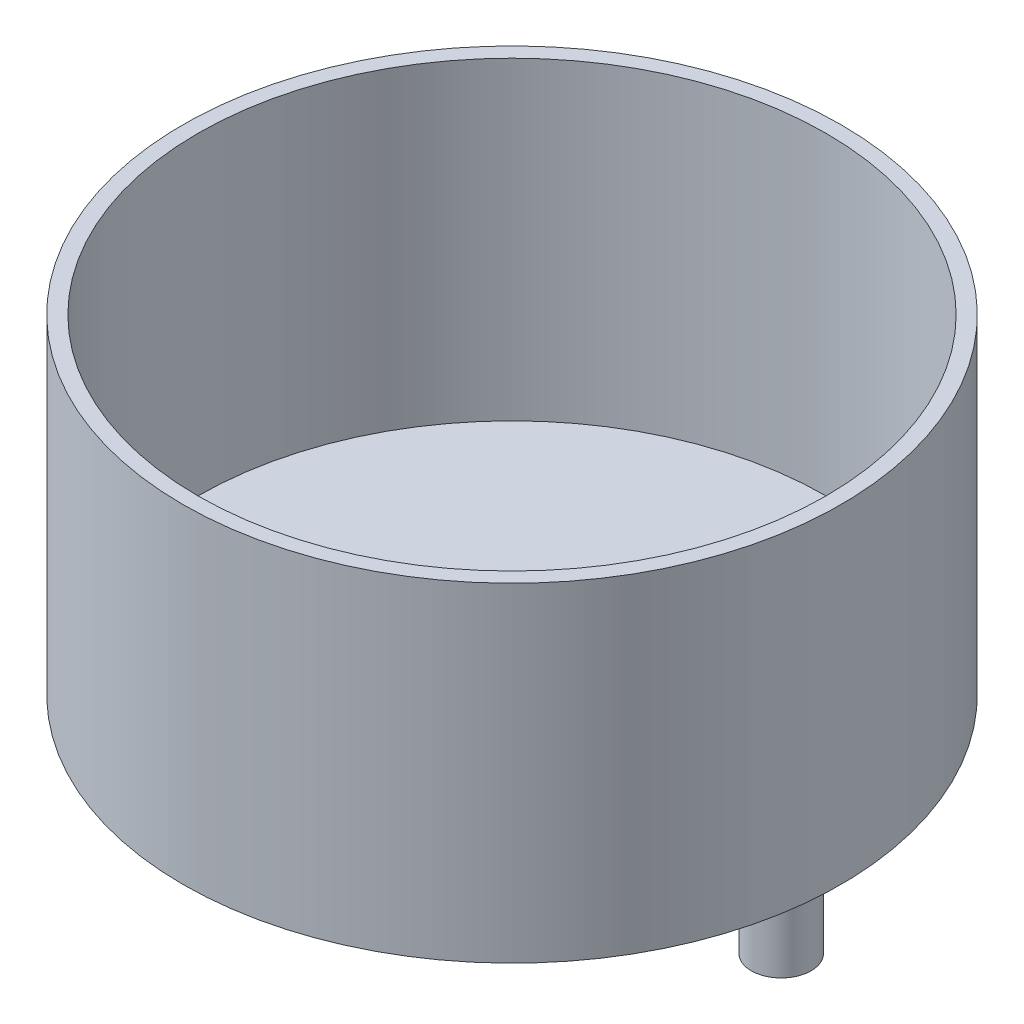
ISO-10303-21;
HEADER;
FILE_DESCRIPTION(('STEP AP214'),'2;1');
FILE_NAME('part.step','',(''),(''),'','','');
FILE_SCHEMA(('AUTOMOTIVE_DESIGN { 1 0 10303 214 1 1 1 1 }'));
ENDSEC;
DATA;
#1=APPLICATION_CONTEXT('core data for automotive mechanical design processes');
#2=APPLICATION_PROTOCOL_DEFINITION('international standard','automotive_design',2000,#1);
#3=PRODUCT_CONTEXT('',#1,'mechanical');
#4=PRODUCT('Part','Part','',(#3));
#5=PRODUCT_RELATED_PRODUCT_CATEGORY('part','',(#4));
#6=PRODUCT_DEFINITION_FORMATION('','',#4);
#7=PRODUCT_DEFINITION_CONTEXT('part definition',#1,'design');
#8=PRODUCT_DEFINITION('design','',#6,#7);
#9=PRODUCT_DEFINITION_SHAPE('','',#8);
#10=(LENGTH_UNIT() NAMED_UNIT(*) SI_UNIT(.MILLI.,.METRE.));
#11=(NAMED_UNIT(*) PLANE_ANGLE_UNIT() SI_UNIT($,.RADIAN.));
#12=(NAMED_UNIT(*) SI_UNIT($,.STERADIAN.) SOLID_ANGLE_UNIT());
#13=UNCERTAINTY_MEASURE_WITH_UNIT(LENGTH_MEASURE(1.E-05),#10,'distance_accuracy_value','');
#14=(GEOMETRIC_REPRESENTATION_CONTEXT(3) GLOBAL_UNCERTAINTY_ASSIGNED_CONTEXT((#13)) GLOBAL_UNIT_ASSIGNED_CONTEXT((#10,
#11,#12)) REPRESENTATION_CONTEXT('',''));
#15=CARTESIAN_POINT('',(0.,0.,0.));
#16=DIRECTION('',(0.,0.,1.));
#17=DIRECTION('',(1.,0.,0.));
#18=AXIS2_PLACEMENT_3D('',#15,#16,#17);
#19=CARTESIAN_POINT('',(0.,0.,0.));
#20=DIRECTION('',(0.,-1.,0.));
#21=DIRECTION('',(0.,0.,-1.));
#22=AXIS2_PLACEMENT_3D('',#19,#20,#21);
#23=CYLINDRICAL_SURFACE('',#22,110.);
#24=CARTESIAN_POINT('',(0.,30.,0.));
#25=DIRECTION('',(0.,-1.,0.));
#26=DIRECTION('',(0.,0.,-1.));
#27=AXIS2_PLACEMENT_3D('',#24,#25,#26);
#28=CIRCLE('',#27,110.);
#29=CARTESIAN_POINT('',(0.,30.,-110.));
#30=VERTEX_POINT('',#29);
#31=EDGE_CURVE('E57',#30,#30,#28,.T.);
#32=ORIENTED_EDGE('',*,*,#31,.T.);
#33=EDGE_LOOP('',(#32));
#34=FACE_BOUND('',#33,.T.);
#35=CARTESIAN_POINT('',(0.,-80.,0.));
#36=DIRECTION('',(0.,-1.,0.));
#37=DIRECTION('',(0.,0.,-1.));
#38=AXIS2_PLACEMENT_3D('',#35,#36,#37);
#39=CIRCLE('',#38,110.);
#40=CARTESIAN_POINT('',(0.,-80.,-110.));
#41=VERTEX_POINT('',#40);
#42=EDGE_CURVE('E10',#41,#41,#39,.T.);
#43=ORIENTED_EDGE('',*,*,#42,.F.);
#44=EDGE_LOOP('',(#43));
#45=FACE_BOUND('',#44,.T.);
#46=ADVANCED_FACE('F40',(#34,#45),#23,.T.);
#47=CARTESIAN_POINT('',(110.,-80.,0.));
#48=DIRECTION('',(0.,-1.,0.));
#49=DIRECTION('',(0.,0.,-1.));
#50=AXIS2_PLACEMENT_3D('',#47,#48,#49);
#51=PLANE('',#50);
#52=CARTESIAN_POINT('',(90.,-80.,0.));
#53=DIRECTION('',(0.,-1.,0.));
#54=DIRECTION('',(0.,0.,-1.));
#55=AXIS2_PLACEMENT_3D('',#52,#53,#54);
#56=CIRCLE('',#55,9.99999999999999);
#57=CARTESIAN_POINT('',(90.,-80.,-9.99999999999999));
#58=VERTEX_POINT('',#57);
#59=EDGE_CURVE('E76',#58,#58,#56,.T.);
#60=ORIENTED_EDGE('',*,*,#59,.F.);
#61=EDGE_LOOP('',(#60));
#62=FACE_BOUND('',#61,.T.);
#63=CARTESIAN_POINT('',(-90.,-80.,0.));
#64=DIRECTION('',(0.,-1.,0.));
#65=DIRECTION('',(0.,0.,-1.));
#66=AXIS2_PLACEMENT_3D('',#63,#64,#65);
#67=CIRCLE('',#66,9.99999999999999);
#68=CARTESIAN_POINT('',(-90.,-80.,-9.99999999999999));
#69=VERTEX_POINT('',#68);
#70=EDGE_CURVE('E72',#69,#69,#67,.T.);
#71=ORIENTED_EDGE('',*,*,#70,.F.);
#72=EDGE_LOOP('',(#71));
#73=FACE_BOUND('',#72,.T.);
#74=CARTESIAN_POINT('',(0.,-80.,0.));
#75=DIRECTION('',(0.,-1.,0.));
#76=DIRECTION('',(0.,0.,-1.));
#77=AXIS2_PLACEMENT_3D('',#74,#75,#76);
#78=CIRCLE('',#77,4.5);
#79=CARTESIAN_POINT('',(0.,-80.,-4.5));
#80=VERTEX_POINT('',#79);
#81=EDGE_CURVE('E63',#80,#80,#78,.T.);
#82=ORIENTED_EDGE('',*,*,#81,.F.);
#83=EDGE_LOOP('',(#82));
#84=FACE_BOUND('',#83,.T.);
#85=ORIENTED_EDGE('',*,*,#42,.T.);
#86=EDGE_LOOP('',(#85));
#87=FACE_BOUND('',#86,.T.);
#88=ADVANCED_FACE('F90',(#62,#73,#84,#87),#51,.T.);
#89=CARTESIAN_POINT('',(105.,-75.,0.));
#90=DIRECTION('',(0.,1.,0.));
#91=DIRECTION('',(0.,0.,1.));
#92=AXIS2_PLACEMENT_3D('',#89,#90,#91);
#93=PLANE('',#92);
#94=CARTESIAN_POINT('',(0.,-75.,0.));
#95=DIRECTION('',(0.,1.,0.));
#96=DIRECTION('',(0.,0.,1.));
#97=AXIS2_PLACEMENT_3D('',#94,#95,#96);
#98=CIRCLE('',#97,4.5);
#99=CARTESIAN_POINT('',(0.,-75.,4.5));
#100=VERTEX_POINT('',#99);
#101=EDGE_CURVE('E64',#100,#100,#98,.F.);
#102=ORIENTED_EDGE('',*,*,#101,.T.);
#103=EDGE_LOOP('',(#102));
#104=FACE_BOUND('',#103,.T.);
#105=CARTESIAN_POINT('',(0.,-75.,0.));
#106=DIRECTION('',(0.,-1.,0.));
#107=DIRECTION('',(0.,0.,-1.));
#108=AXIS2_PLACEMENT_3D('',#105,#106,#107);
#109=CIRCLE('',#108,105.);
#110=CARTESIAN_POINT('',(0.,-75.,-105.));
#111=VERTEX_POINT('',#110);
#112=EDGE_CURVE('E47',#111,#111,#109,.T.);
#113=ORIENTED_EDGE('',*,*,#112,.F.);
#114=EDGE_LOOP('',(#113));
#115=FACE_BOUND('',#114,.T.);
#116=ADVANCED_FACE('F93',(#104,#115),#93,.T.);
#117=CARTESIAN_POINT('',(0.,0.,0.));
#118=DIRECTION('',(0.,-1.,0.));
#119=DIRECTION('',(0.,0.,-1.));
#120=AXIS2_PLACEMENT_3D('',#117,#118,#119);
#121=CYLINDRICAL_SURFACE('',#120,105.);
#122=ORIENTED_EDGE('',*,*,#112,.T.);
#123=EDGE_LOOP('',(#122));
#124=FACE_BOUND('',#123,.T.);
#125=CARTESIAN_POINT('',(0.,30.,0.));
#126=DIRECTION('',(0.,-1.,0.));
#127=DIRECTION('',(0.,0.,-1.));
#128=AXIS2_PLACEMENT_3D('',#125,#126,#127);
#129=CIRCLE('',#128,105.);
#130=CARTESIAN_POINT('',(0.,30.,-105.));
#131=VERTEX_POINT('',#130);
#132=EDGE_CURVE('E52',#131,#131,#129,.T.);
#133=ORIENTED_EDGE('',*,*,#132,.F.);
#134=EDGE_LOOP('',(#133));
#135=FACE_BOUND('',#134,.T.);
#136=ADVANCED_FACE('F111',(#124,#135),#121,.F.);
#137=CARTESIAN_POINT('',(105.,30.,0.));
#138=DIRECTION('',(0.,1.,0.));
#139=DIRECTION('',(0.,0.,1.));
#140=AXIS2_PLACEMENT_3D('',#137,#138,#139);
#141=PLANE('',#140);
#142=ORIENTED_EDGE('',*,*,#132,.T.);
#143=EDGE_LOOP('',(#142));
#144=FACE_BOUND('',#143,.T.);
#145=ORIENTED_EDGE('',*,*,#31,.F.);
#146=EDGE_LOOP('',(#145));
#147=FACE_BOUND('',#146,.T.);
#148=ADVANCED_FACE('F101',(#144,#147),#141,.T.);
#149=CARTESIAN_POINT('',(0.,30.001,0.));
#150=DIRECTION('',(0.,-1.,0.));
#151=DIRECTION('',(0.,0.,-1.));
#152=AXIS2_PLACEMENT_3D('',#149,#150,#151);
#153=CYLINDRICAL_SURFACE('',#152,4.5);
#154=ORIENTED_EDGE('',*,*,#101,.F.);
#155=EDGE_LOOP('',(#154));
#156=FACE_BOUND('',#155,.T.);
#157=ORIENTED_EDGE('',*,*,#81,.T.);
#158=EDGE_LOOP('',(#157));
#159=FACE_BOUND('',#158,.T.);
#160=ADVANCED_FACE('F98',(#156,#159),#153,.F.);
#161=CARTESIAN_POINT('',(-90.,-110.,0.));
#162=DIRECTION('',(0.,1.,0.));
#163=DIRECTION('',(0.,0.,1.));
#164=AXIS2_PLACEMENT_3D('',#161,#162,#163);
#165=CYLINDRICAL_SURFACE('',#164,9.99999999999999);
#166=CARTESIAN_POINT('',(-90.,-110.,0.));
#167=DIRECTION('',(0.,-1.,0.));
#168=DIRECTION('',(0.,0.,-1.));
#169=AXIS2_PLACEMENT_3D('',#166,#167,#168);
#170=CIRCLE('',#169,9.99999999999999);
#171=CARTESIAN_POINT('',(-90.,-110.,-9.99999999999999));
#172=VERTEX_POINT('',#171);
#173=EDGE_CURVE('E68',#172,#172,#170,.T.);
#174=ORIENTED_EDGE('',*,*,#173,.F.);
#175=EDGE_LOOP('',(#174));
#176=FACE_BOUND('',#175,.T.);
#177=ORIENTED_EDGE('',*,*,#70,.T.);
#178=EDGE_LOOP('',(#177));
#179=FACE_BOUND('',#178,.T.);
#180=ADVANCED_FACE('F100',(#176,#179),#165,.T.);
#181=CARTESIAN_POINT('',(-90.,-110.,0.));
#182=DIRECTION('',(0.,-1.,0.));
#183=DIRECTION('',(0.,0.,-1.));
#184=AXIS2_PLACEMENT_3D('',#181,#182,#183);
#185=PLANE('',#184);
#186=ORIENTED_EDGE('',*,*,#173,.T.);
#187=EDGE_LOOP('',(#186));
#188=FACE_BOUND('',#187,.T.);
#189=ADVANCED_FACE('F108',(#188),#185,.T.);
#190=CARTESIAN_POINT('',(90.,-110.,0.));
#191=DIRECTION('',(0.,1.,0.));
#192=DIRECTION('',(0.,0.,1.));
#193=AXIS2_PLACEMENT_3D('',#190,#191,#192);
#194=CYLINDRICAL_SURFACE('',#193,9.99999999999999);
#195=CARTESIAN_POINT('',(90.,-110.,0.));
#196=DIRECTION('',(0.,-1.,0.));
#197=DIRECTION('',(0.,0.,-1.));
#198=AXIS2_PLACEMENT_3D('',#195,#196,#197);
#199=CIRCLE('',#198,9.99999999999999);
#200=CARTESIAN_POINT('',(90.,-110.,-9.99999999999999));
#201=VERTEX_POINT('',#200);
#202=EDGE_CURVE('E80',#201,#201,#199,.T.);
#203=ORIENTED_EDGE('',*,*,#202,.F.);
#204=EDGE_LOOP('',(#203));
#205=FACE_BOUND('',#204,.T.);
#206=ORIENTED_EDGE('',*,*,#59,.T.);
#207=EDGE_LOOP('',(#206));
#208=FACE_BOUND('',#207,.T.);
#209=ADVANCED_FACE('F88',(#205,#208),#194,.T.);
#210=CARTESIAN_POINT('',(90.,-110.,0.));
#211=DIRECTION('',(0.,-1.,0.));
#212=DIRECTION('',(0.,0.,-1.));
#213=AXIS2_PLACEMENT_3D('',#210,#211,#212);
#214=PLANE('',#213);
#215=ORIENTED_EDGE('',*,*,#202,.T.);
#216=EDGE_LOOP('',(#215));
#217=FACE_BOUND('',#216,.T.);
#218=ADVANCED_FACE('F182',(#217),#214,.T.);
#219=CLOSED_SHELL('',(#46,#88,#116,#136,#148,#160,#180,#189,#209,#218));
#220=MANIFOLD_SOLID_BREP('B2',#219);
#221=ADVANCED_BREP_SHAPE_REPRESENTATION('',(#18,#220),#14);
#222=SHAPE_DEFINITION_REPRESENTATION(#9,#221);
ENDSEC;
END-ISO-10303-21;
